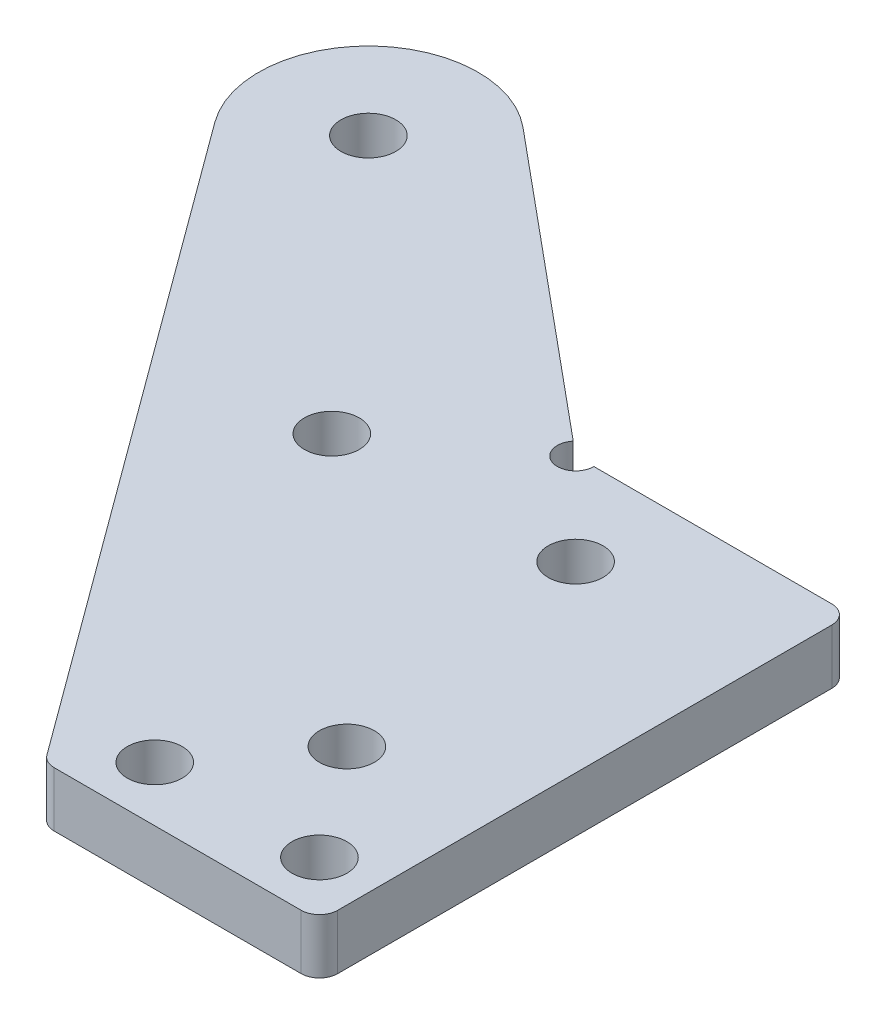
ISO-10303-21;
HEADER;
FILE_DESCRIPTION(('STEP AP214'),'2;1');
FILE_NAME('part.step','',(''),(''),'','','');
FILE_SCHEMA(('AUTOMOTIVE_DESIGN { 1 0 10303 214 1 1 1 1 }'));
ENDSEC;
DATA;
#1=APPLICATION_CONTEXT('core data for automotive mechanical design processes');
#2=APPLICATION_PROTOCOL_DEFINITION('international standard','automotive_design',2000,#1);
#3=PRODUCT_CONTEXT('',#1,'mechanical');
#4=PRODUCT('Part','Part','',(#3));
#5=PRODUCT_RELATED_PRODUCT_CATEGORY('part','',(#4));
#6=PRODUCT_DEFINITION_FORMATION('','',#4);
#7=PRODUCT_DEFINITION_CONTEXT('part definition',#1,'design');
#8=PRODUCT_DEFINITION('design','',#6,#7);
#9=PRODUCT_DEFINITION_SHAPE('','',#8);
#10=(LENGTH_UNIT() NAMED_UNIT(*) SI_UNIT(.MILLI.,.METRE.));
#11=(NAMED_UNIT(*) PLANE_ANGLE_UNIT() SI_UNIT($,.RADIAN.));
#12=(NAMED_UNIT(*) SI_UNIT($,.STERADIAN.) SOLID_ANGLE_UNIT());
#13=UNCERTAINTY_MEASURE_WITH_UNIT(LENGTH_MEASURE(1.E-05),#10,'distance_accuracy_value','');
#14=(GEOMETRIC_REPRESENTATION_CONTEXT(3) GLOBAL_UNCERTAINTY_ASSIGNED_CONTEXT((#13)) GLOBAL_UNIT_ASSIGNED_CONTEXT((#10,
#11,#12)) REPRESENTATION_CONTEXT('',''));
#15=CARTESIAN_POINT('',(0.,0.,0.));
#16=DIRECTION('',(0.,0.,1.));
#17=DIRECTION('',(1.,0.,0.));
#18=AXIS2_PLACEMENT_3D('',#15,#16,#17);
#19=CARTESIAN_POINT('',(-20.8250812548085,3.,-24.));
#20=DIRECTION('',(0.,1.,0.));
#21=DIRECTION('',(0.,0.,1.));
#22=AXIS2_PLACEMENT_3D('',#19,#20,#21);
#23=PLANE('',#22);
#24=CARTESIAN_POINT('',(-7.71745766964896,3.,-8.89403416031368));
#25=DIRECTION('',(0.,1.,0.));
#26=DIRECTION('',(0.,0.,1.));
#27=AXIS2_PLACEMENT_3D('',#24,#25,#26);
#28=CIRCLE('',#27,1.5);
#29=CARTESIAN_POINT('',(-7.71745766964896,3.,-7.39403416031368));
#30=VERTEX_POINT('',#29);
#31=EDGE_CURVE('E274',#30,#30,#28,.T.);
#32=ORIENTED_EDGE('',*,*,#31,.F.);
#33=EDGE_LOOP('',(#32));
#34=FACE_BOUND('',#33,.T.);
#35=CARTESIAN_POINT('',(7.50000000000001,3.,5.5));
#36=DIRECTION('',(0.,1.,0.));
#37=DIRECTION('',(0.,0.,1.));
#38=AXIS2_PLACEMENT_3D('',#35,#36,#37);
#39=CIRCLE('',#38,1.5);
#40=CARTESIAN_POINT('',(7.50000000000001,3.,7.));
#41=VERTEX_POINT('',#40);
#42=EDGE_CURVE('E258',#41,#41,#39,.T.);
#43=ORIENTED_EDGE('',*,*,#42,.F.);
#44=EDGE_LOOP('',(#43));
#45=FACE_BOUND('',#44,.T.);
#46=CARTESIAN_POINT('',(3.00000000000001,3.,11.5));
#47=DIRECTION('',(0.,1.,0.));
#48=DIRECTION('',(0.,0.,1.));
#49=AXIS2_PLACEMENT_3D('',#46,#47,#48);
#50=CIRCLE('',#49,1.5);
#51=CARTESIAN_POINT('',(3.00000000000001,3.,13.));
#52=VERTEX_POINT('',#51);
#53=EDGE_CURVE('E234',#52,#52,#50,.T.);
#54=ORIENTED_EDGE('',*,*,#53,.F.);
#55=EDGE_LOOP('',(#54));
#56=FACE_BOUND('',#55,.T.);
#57=DIRECTION('',(0.,0.,-1.));
#58=VECTOR('',#57,1.);
#59=CARTESIAN_POINT('',(15.,3.,-14.5));
#60=LINE('',#59,#58);
#61=CARTESIAN_POINT('',(15.,3.,13.5));
#62=VERTEX_POINT('',#61);
#63=CARTESIAN_POINT('',(15.,3.,-13.5));
#64=VERTEX_POINT('',#63);
#65=EDGE_CURVE('E212',#62,#64,#60,.T.);
#66=ORIENTED_EDGE('',*,*,#65,.T.);
#67=CARTESIAN_POINT('',(14.,3.,-13.5));
#68=DIRECTION('',(0.,1.,0.));
#69=DIRECTION('',(0.,0.,1.));
#70=AXIS2_PLACEMENT_3D('',#67,#68,#69);
#71=CIRCLE('',#70,1.);
#72=CARTESIAN_POINT('',(14.,3.,-14.5));
#73=VERTEX_POINT('',#72);
#74=EDGE_CURVE('E127',#64,#73,#71,.T.);
#75=ORIENTED_EDGE('',*,*,#74,.T.);
#76=DIRECTION('',(-1.,0.,0.));
#77=VECTOR('',#76,1.);
#78=CARTESIAN_POINT('',(1.00000000000001,3.,-14.5));
#79=LINE('',#78,#77);
#80=CARTESIAN_POINT('',(1.00000000000001,3.,-14.5));
#81=VERTEX_POINT('',#80);
#82=EDGE_CURVE('E120',#73,#81,#79,.T.);
#83=ORIENTED_EDGE('',*,*,#82,.T.);
#84=CARTESIAN_POINT('',(0.,3.,-14.5));
#85=DIRECTION('',(0.,-1.,0.));
#86=DIRECTION('',(0.,0.,1.));
#87=AXIS2_PLACEMENT_3D('',#84,#85,#86);
#88=CIRCLE('',#87,1.);
#89=CARTESIAN_POINT('',(-0.769199876693128,3.,-15.1390082547943));
#90=VERTEX_POINT('',#89);
#91=EDGE_CURVE('E124',#81,#90,#88,.T.);
#92=ORIENTED_EDGE('',*,*,#91,.T.);
#93=DIRECTION('',(-0.769199876693136,0.,-0.639008254794306));
#94=VECTOR('',#93,1.);
#95=CARTESIAN_POINT('',(-16.9910317260426,3.,-28.6151992601588));
#96=LINE('',#95,#94);
#97=CARTESIAN_POINT('',(-16.9910317260426,3.,-28.6151992601588));
#98=VERTEX_POINT('',#97);
#99=EDGE_CURVE('E143',#90,#98,#96,.T.);
#100=ORIENTED_EDGE('',*,*,#99,.T.);
#101=CARTESIAN_POINT('',(-20.8250812548085,3.,-24.));
#102=DIRECTION('',(0.,1.,0.));
#103=DIRECTION('',(0.,0.,1.));
#104=AXIS2_PLACEMENT_3D('',#101,#102,#103);
#105=CIRCLE('',#104,6.00000000000001);
#106=CARTESIAN_POINT('',(-25.6613869768904,3.,-20.4489231263519));
#107=VERTEX_POINT('',#106);
#108=EDGE_CURVE('E221',#98,#107,#105,.T.);
#109=ORIENTED_EDGE('',*,*,#108,.T.);
#110=DIRECTION('',(0.59184614560801,0.,0.806050953680313));
#111=VECTOR('',#110,1.);
#112=CARTESIAN_POINT('',(-25.6613869768904,3.,-20.4489231263519));
#113=LINE('',#112,#111);
#114=CARTESIAN_POINT('',(-0.299688604590068,3.,14.091846145608));
#115=VERTEX_POINT('',#114);
#116=EDGE_CURVE('E239',#107,#115,#113,.T.);
#117=ORIENTED_EDGE('',*,*,#116,.T.);
#118=CARTESIAN_POINT('',(0.50636234909025,3.,13.5));
#119=DIRECTION('',(0.,1.,0.));
#120=DIRECTION('',(0.,0.,1.));
#121=AXIS2_PLACEMENT_3D('',#118,#119,#120);
#122=CIRCLE('',#121,1.);
#123=CARTESIAN_POINT('',(0.50636234909025,3.,14.5));
#124=VERTEX_POINT('',#123);
#125=EDGE_CURVE('E66',#115,#124,#122,.T.);
#126=ORIENTED_EDGE('',*,*,#125,.T.);
#127=DIRECTION('',(1.,0.,0.));
#128=VECTOR('',#127,1.);
#129=CARTESIAN_POINT('',(15.,3.,14.5));
#130=LINE('',#129,#128);
#131=CARTESIAN_POINT('',(14.,3.,14.5));
#132=VERTEX_POINT('',#131);
#133=EDGE_CURVE('E190',#124,#132,#130,.T.);
#134=ORIENTED_EDGE('',*,*,#133,.T.);
#135=CARTESIAN_POINT('',(14.,3.,13.5));
#136=DIRECTION('',(0.,1.,0.));
#137=DIRECTION('',(0.,0.,1.));
#138=AXIS2_PLACEMENT_3D('',#135,#136,#137);
#139=CIRCLE('',#138,1.);
#140=EDGE_CURVE('E177',#132,#62,#139,.T.);
#141=ORIENTED_EDGE('',*,*,#140,.T.);
#142=EDGE_LOOP('',(#66,#75,#83,#92,#100,#109,#117,#126,#134,#141));
#143=FACE_BOUND('',#142,.T.);
#144=CARTESIAN_POINT('',(12.,3.,11.5));
#145=DIRECTION('',(0.,1.,0.));
#146=DIRECTION('',(0.,0.,1.));
#147=AXIS2_PLACEMENT_3D('',#144,#145,#146);
#148=CIRCLE('',#147,1.5);
#149=CARTESIAN_POINT('',(12.,3.,13.));
#150=VERTEX_POINT('',#149);
#151=EDGE_CURVE('E250',#150,#150,#148,.T.);
#152=ORIENTED_EDGE('',*,*,#151,.F.);
#153=EDGE_LOOP('',(#152));
#154=FACE_BOUND('',#153,.T.);
#155=CARTESIAN_POINT('',(5.,3.,-9.50000000000002));
#156=DIRECTION('',(0.,1.,0.));
#157=DIRECTION('',(0.,0.,1.));
#158=AXIS2_PLACEMENT_3D('',#155,#156,#157);
#159=CIRCLE('',#158,1.5);
#160=CARTESIAN_POINT('',(5.,3.,-8.00000000000002));
#161=VERTEX_POINT('',#160);
#162=EDGE_CURVE('E266',#161,#161,#159,.T.);
#163=ORIENTED_EDGE('',*,*,#162,.F.);
#164=EDGE_LOOP('',(#163));
#165=FACE_BOUND('',#164,.T.);
#166=CARTESIAN_POINT('',(-20.8250812548085,3.,-24.));
#167=DIRECTION('',(0.,1.,0.));
#168=DIRECTION('',(0.,0.,1.));
#169=AXIS2_PLACEMENT_3D('',#166,#167,#168);
#170=CIRCLE('',#169,1.5);
#171=CARTESIAN_POINT('',(-20.8250812548085,3.,-22.5));
#172=VERTEX_POINT('',#171);
#173=EDGE_CURVE('E282',#172,#172,#170,.T.);
#174=ORIENTED_EDGE('',*,*,#173,.F.);
#175=EDGE_LOOP('',(#174));
#176=FACE_BOUND('',#175,.T.);
#177=ADVANCED_FACE('F44',(#34,#45,#56,#143,#154,#165,#176),#23,.T.);
#178=CARTESIAN_POINT('',(-20.8250812548085,0.,-24.));
#179=DIRECTION('',(0.,1.,0.));
#180=DIRECTION('',(0.,0.,1.));
#181=AXIS2_PLACEMENT_3D('',#178,#179,#180);
#182=PLANE('',#181);
#183=DIRECTION('',(-1.,0.,0.));
#184=VECTOR('',#183,1.);
#185=CARTESIAN_POINT('',(1.00000000000001,0.,-14.5));
#186=LINE('',#185,#184);
#187=CARTESIAN_POINT('',(14.,0.,-14.5));
#188=VERTEX_POINT('',#187);
#189=CARTESIAN_POINT('',(1.00000000000001,0.,-14.5));
#190=VERTEX_POINT('',#189);
#191=EDGE_CURVE('E147',#188,#190,#186,.T.);
#192=ORIENTED_EDGE('',*,*,#191,.F.);
#193=CARTESIAN_POINT('',(14.,0.,-13.5));
#194=DIRECTION('',(0.,1.,0.));
#195=DIRECTION('',(0.,0.,1.));
#196=AXIS2_PLACEMENT_3D('',#193,#194,#195);
#197=CIRCLE('',#196,1.);
#198=CARTESIAN_POINT('',(15.,0.,-13.5));
#199=VERTEX_POINT('',#198);
#200=EDGE_CURVE('E165',#188,#199,#197,.F.);
#201=ORIENTED_EDGE('',*,*,#200,.T.);
#202=DIRECTION('',(0.,0.,-1.));
#203=VECTOR('',#202,1.);
#204=CARTESIAN_POINT('',(15.,0.,-14.5));
#205=LINE('',#204,#203);
#206=CARTESIAN_POINT('',(15.,0.,13.5));
#207=VERTEX_POINT('',#206);
#208=EDGE_CURVE('E133',#207,#199,#205,.T.);
#209=ORIENTED_EDGE('',*,*,#208,.F.);
#210=CARTESIAN_POINT('',(14.,0.,13.5));
#211=DIRECTION('',(0.,1.,0.));
#212=DIRECTION('',(0.,0.,1.));
#213=AXIS2_PLACEMENT_3D('',#210,#211,#212);
#214=CIRCLE('',#213,1.);
#215=CARTESIAN_POINT('',(14.,0.,14.5));
#216=VERTEX_POINT('',#215);
#217=EDGE_CURVE('E162',#207,#216,#214,.F.);
#218=ORIENTED_EDGE('',*,*,#217,.T.);
#219=DIRECTION('',(1.,0.,0.));
#220=VECTOR('',#219,1.);
#221=CARTESIAN_POINT('',(15.,0.,14.5));
#222=LINE('',#221,#220);
#223=CARTESIAN_POINT('',(0.50636234909025,0.,14.5));
#224=VERTEX_POINT('',#223);
#225=EDGE_CURVE('E189',#224,#216,#222,.T.);
#226=ORIENTED_EDGE('',*,*,#225,.F.);
#227=CARTESIAN_POINT('',(0.50636234909025,0.,13.5));
#228=DIRECTION('',(0.,1.,0.));
#229=DIRECTION('',(0.,0.,1.));
#230=AXIS2_PLACEMENT_3D('',#227,#228,#229);
#231=CIRCLE('',#230,1.);
#232=CARTESIAN_POINT('',(-0.299688604590068,0.,14.091846145608));
#233=VERTEX_POINT('',#232);
#234=EDGE_CURVE('E154',#224,#233,#231,.F.);
#235=ORIENTED_EDGE('',*,*,#234,.T.);
#236=DIRECTION('',(0.59184614560801,0.,0.806050953680313));
#237=VECTOR('',#236,1.);
#238=CARTESIAN_POINT('',(-25.6613869768904,0.,-20.4489231263519));
#239=LINE('',#238,#237);
#240=CARTESIAN_POINT('',(-25.6613869768904,0.,-20.4489231263519));
#241=VERTEX_POINT('',#240);
#242=EDGE_CURVE('E199',#241,#233,#239,.T.);
#243=ORIENTED_EDGE('',*,*,#242,.F.);
#244=CARTESIAN_POINT('',(-20.8250812548085,0.,-24.));
#245=DIRECTION('',(0.,1.,0.));
#246=DIRECTION('',(0.,0.,1.));
#247=AXIS2_PLACEMENT_3D('',#244,#245,#246);
#248=CIRCLE('',#247,6.00000000000001);
#249=CARTESIAN_POINT('',(-16.9910317260426,0.,-28.6151992601588));
#250=VERTEX_POINT('',#249);
#251=EDGE_CURVE('E205',#250,#241,#248,.T.);
#252=ORIENTED_EDGE('',*,*,#251,.F.);
#253=DIRECTION('',(-0.769199876693136,0.,-0.639008254794306));
#254=VECTOR('',#253,1.);
#255=CARTESIAN_POINT('',(-16.9910317260426,0.,-28.6151992601588));
#256=LINE('',#255,#254);
#257=CARTESIAN_POINT('',(-0.769199876693128,0.,-15.1390082547943));
#258=VERTEX_POINT('',#257);
#259=EDGE_CURVE('E224',#258,#250,#256,.T.);
#260=ORIENTED_EDGE('',*,*,#259,.F.);
#261=CARTESIAN_POINT('',(0.,0.,-14.5));
#262=DIRECTION('',(0.,-1.,0.));
#263=DIRECTION('',(0.,0.,1.));
#264=AXIS2_PLACEMENT_3D('',#261,#262,#263);
#265=CIRCLE('',#264,1.);
#266=EDGE_CURVE('E227',#190,#258,#265,.T.);
#267=ORIENTED_EDGE('',*,*,#266,.F.);
#268=EDGE_LOOP('',(#192,#201,#209,#218,#226,#235,#243,#252,#260,#267));
#269=FACE_BOUND('',#268,.T.);
#270=CARTESIAN_POINT('',(3.00000000000001,0.,11.5));
#271=DIRECTION('',(0.,1.,0.));
#272=DIRECTION('',(0.,0.,1.));
#273=AXIS2_PLACEMENT_3D('',#270,#271,#272);
#274=CIRCLE('',#273,1.5);
#275=CARTESIAN_POINT('',(3.00000000000001,0.,13.));
#276=VERTEX_POINT('',#275);
#277=EDGE_CURVE('E246',#276,#276,#274,.T.);
#278=ORIENTED_EDGE('',*,*,#277,.T.);
#279=EDGE_LOOP('',(#278));
#280=FACE_BOUND('',#279,.T.);
#281=CARTESIAN_POINT('',(12.,0.,11.5));
#282=DIRECTION('',(0.,1.,0.));
#283=DIRECTION('',(0.,0.,1.));
#284=AXIS2_PLACEMENT_3D('',#281,#282,#283);
#285=CIRCLE('',#284,1.5);
#286=CARTESIAN_POINT('',(12.,0.,13.));
#287=VERTEX_POINT('',#286);
#288=EDGE_CURVE('E254',#287,#287,#285,.T.);
#289=ORIENTED_EDGE('',*,*,#288,.T.);
#290=EDGE_LOOP('',(#289));
#291=FACE_BOUND('',#290,.T.);
#292=CARTESIAN_POINT('',(7.50000000000001,0.,5.5));
#293=DIRECTION('',(0.,1.,0.));
#294=DIRECTION('',(0.,0.,1.));
#295=AXIS2_PLACEMENT_3D('',#292,#293,#294);
#296=CIRCLE('',#295,1.5);
#297=CARTESIAN_POINT('',(7.50000000000001,0.,7.));
#298=VERTEX_POINT('',#297);
#299=EDGE_CURVE('E262',#298,#298,#296,.T.);
#300=ORIENTED_EDGE('',*,*,#299,.T.);
#301=EDGE_LOOP('',(#300));
#302=FACE_BOUND('',#301,.T.);
#303=CARTESIAN_POINT('',(5.,0.,-9.50000000000002));
#304=DIRECTION('',(0.,1.,0.));
#305=DIRECTION('',(0.,0.,1.));
#306=AXIS2_PLACEMENT_3D('',#303,#304,#305);
#307=CIRCLE('',#306,1.5);
#308=CARTESIAN_POINT('',(5.,0.,-8.00000000000002));
#309=VERTEX_POINT('',#308);
#310=EDGE_CURVE('E270',#309,#309,#307,.T.);
#311=ORIENTED_EDGE('',*,*,#310,.T.);
#312=EDGE_LOOP('',(#311));
#313=FACE_BOUND('',#312,.T.);
#314=CARTESIAN_POINT('',(-7.71745766964896,0.,-8.89403416031368));
#315=DIRECTION('',(0.,1.,0.));
#316=DIRECTION('',(0.,0.,1.));
#317=AXIS2_PLACEMENT_3D('',#314,#315,#316);
#318=CIRCLE('',#317,1.5);
#319=CARTESIAN_POINT('',(-7.71745766964896,0.,-7.39403416031368));
#320=VERTEX_POINT('',#319);
#321=EDGE_CURVE('E278',#320,#320,#318,.T.);
#322=ORIENTED_EDGE('',*,*,#321,.T.);
#323=EDGE_LOOP('',(#322));
#324=FACE_BOUND('',#323,.T.);
#325=CARTESIAN_POINT('',(-20.8250812548085,0.,-24.));
#326=DIRECTION('',(0.,1.,0.));
#327=DIRECTION('',(0.,0.,1.));
#328=AXIS2_PLACEMENT_3D('',#325,#326,#327);
#329=CIRCLE('',#328,1.5);
#330=CARTESIAN_POINT('',(-20.8250812548085,0.,-22.5));
#331=VERTEX_POINT('',#330);
#332=EDGE_CURVE('E286',#331,#331,#329,.T.);
#333=ORIENTED_EDGE('',*,*,#332,.T.);
#334=EDGE_LOOP('',(#333));
#335=FACE_BOUND('',#334,.T.);
#336=ADVANCED_FACE('F193',(#269,#280,#291,#302,#313,#324,#335),#182,.F.);
#337=CARTESIAN_POINT('',(1.00000000000001,3.,-14.5));
#338=DIRECTION('',(0.,0.,1.));
#339=DIRECTION('',(1.,0.,0.));
#340=AXIS2_PLACEMENT_3D('',#337,#338,#339);
#341=PLANE('',#340);
#342=ORIENTED_EDGE('',*,*,#82,.F.);
#343=DIRECTION('',(0.,-1.,0.));
#344=VECTOR('',#343,1.);
#345=CARTESIAN_POINT('',(14.,3.,-14.5));
#346=LINE('',#345,#344);
#347=EDGE_CURVE('E150',#73,#188,#346,.T.);
#348=ORIENTED_EDGE('',*,*,#347,.T.);
#349=ORIENTED_EDGE('',*,*,#191,.T.);
#350=DIRECTION('',(0.,-1.,0.));
#351=VECTOR('',#350,1.);
#352=CARTESIAN_POINT('',(1.00000000000001,3.,-14.5));
#353=LINE('',#352,#351);
#354=EDGE_CURVE('E138',#81,#190,#353,.T.);
#355=ORIENTED_EDGE('',*,*,#354,.F.);
#356=EDGE_LOOP('',(#342,#348,#349,#355));
#357=FACE_BOUND('',#356,.T.);
#358=ADVANCED_FACE('F145',(#357),#341,.F.);
#359=CARTESIAN_POINT('',(0.,3.,-14.5));
#360=DIRECTION('',(0.,-1.,0.));
#361=DIRECTION('',(0.,0.,-1.));
#362=AXIS2_PLACEMENT_3D('',#359,#360,#361);
#363=CYLINDRICAL_SURFACE('',#362,1.);
#364=ORIENTED_EDGE('',*,*,#266,.T.);
#365=DIRECTION('',(0.,-1.,0.));
#366=VECTOR('',#365,1.);
#367=CARTESIAN_POINT('',(-0.769199876693128,3.,-15.1390082547943));
#368=LINE('',#367,#366);
#369=EDGE_CURVE('E140',#90,#258,#368,.T.);
#370=ORIENTED_EDGE('',*,*,#369,.F.);
#371=ORIENTED_EDGE('',*,*,#91,.F.);
#372=ORIENTED_EDGE('',*,*,#354,.T.);
#373=EDGE_LOOP('',(#364,#370,#371,#372));
#374=FACE_BOUND('',#373,.T.);
#375=ADVANCED_FACE('F137',(#374),#363,.F.);
#376=CARTESIAN_POINT('',(-16.9910317260426,3.,-28.6151992601588));
#377=DIRECTION('',(-0.639008254794306,0.,0.769199876693136));
#378=DIRECTION('',(0.769199876693136,0.,0.639008254794306));
#379=AXIS2_PLACEMENT_3D('',#376,#377,#378);
#380=PLANE('',#379);
#381=ORIENTED_EDGE('',*,*,#259,.T.);
#382=DIRECTION('',(0.,-1.,0.));
#383=VECTOR('',#382,1.);
#384=CARTESIAN_POINT('',(-16.9910317260426,3.,-28.6151992601588));
#385=LINE('',#384,#383);
#386=EDGE_CURVE('E156',#98,#250,#385,.T.);
#387=ORIENTED_EDGE('',*,*,#386,.F.);
#388=ORIENTED_EDGE('',*,*,#99,.F.);
#389=ORIENTED_EDGE('',*,*,#369,.T.);
#390=EDGE_LOOP('',(#381,#387,#388,#389));
#391=FACE_BOUND('',#390,.T.);
#392=ADVANCED_FACE('F323',(#391),#380,.F.);
#393=CARTESIAN_POINT('',(-20.8250812548085,3.,-24.));
#394=DIRECTION('',(0.,-1.,0.));
#395=DIRECTION('',(0.,0.,-1.));
#396=AXIS2_PLACEMENT_3D('',#393,#394,#395);
#397=CYLINDRICAL_SURFACE('',#396,6.00000000000001);
#398=ORIENTED_EDGE('',*,*,#251,.T.);
#399=DIRECTION('',(0.,-1.,0.));
#400=VECTOR('',#399,1.);
#401=CARTESIAN_POINT('',(-25.6613869768904,3.,-20.4489231263519));
#402=LINE('',#401,#400);
#403=EDGE_CURVE('E209',#107,#241,#402,.T.);
#404=ORIENTED_EDGE('',*,*,#403,.F.);
#405=ORIENTED_EDGE('',*,*,#108,.F.);
#406=ORIENTED_EDGE('',*,*,#386,.T.);
#407=EDGE_LOOP('',(#398,#404,#405,#406));
#408=FACE_BOUND('',#407,.T.);
#409=ADVANCED_FACE('F219',(#408),#397,.T.);
#410=CARTESIAN_POINT('',(-25.6613869768904,3.,-20.4489231263519));
#411=DIRECTION('',(0.806050953680313,0.,-0.591846145608011));
#412=DIRECTION('',(-0.591846145608011,0.,-0.806050953680313));
#413=AXIS2_PLACEMENT_3D('',#410,#411,#412);
#414=PLANE('',#413);
#415=ORIENTED_EDGE('',*,*,#242,.T.);
#416=DIRECTION('',(0.,-1.,0.));
#417=VECTOR('',#416,1.);
#418=CARTESIAN_POINT('',(-0.299688604590061,3.,14.091846145608));
#419=LINE('',#418,#417);
#420=EDGE_CURVE('E11',#233,#115,#419,.F.);
#421=ORIENTED_EDGE('',*,*,#420,.T.);
#422=ORIENTED_EDGE('',*,*,#116,.F.);
#423=ORIENTED_EDGE('',*,*,#403,.T.);
#424=EDGE_LOOP('',(#415,#421,#422,#423));
#425=FACE_BOUND('',#424,.T.);
#426=ADVANCED_FACE('F317',(#425),#414,.F.);
#427=CARTESIAN_POINT('',(15.,3.,14.5));
#428=DIRECTION('',(0.,0.,-1.));
#429=DIRECTION('',(-1.,0.,0.));
#430=AXIS2_PLACEMENT_3D('',#427,#428,#429);
#431=PLANE('',#430);
#432=ORIENTED_EDGE('',*,*,#225,.T.);
#433=DIRECTION('',(0.,-1.,0.));
#434=VECTOR('',#433,1.);
#435=CARTESIAN_POINT('',(14.,3.,14.5));
#436=LINE('',#435,#434);
#437=EDGE_CURVE('E53',#216,#132,#436,.F.);
#438=ORIENTED_EDGE('',*,*,#437,.T.);
#439=ORIENTED_EDGE('',*,*,#133,.F.);
#440=DIRECTION('',(0.,-1.,0.));
#441=VECTOR('',#440,1.);
#442=CARTESIAN_POINT('',(0.50636234909025,3.,14.5));
#443=LINE('',#442,#441);
#444=EDGE_CURVE('E182',#124,#224,#443,.T.);
#445=ORIENTED_EDGE('',*,*,#444,.T.);
#446=EDGE_LOOP('',(#432,#438,#439,#445));
#447=FACE_BOUND('',#446,.T.);
#448=ADVANCED_FACE('F188',(#447),#431,.F.);
#449=CARTESIAN_POINT('',(15.,3.,-14.5));
#450=DIRECTION('',(-1.,0.,0.));
#451=DIRECTION('',(0.,0.,1.));
#452=AXIS2_PLACEMENT_3D('',#449,#450,#451);
#453=PLANE('',#452);
#454=ORIENTED_EDGE('',*,*,#208,.T.);
#455=DIRECTION('',(0.,-1.,0.));
#456=VECTOR('',#455,1.);
#457=CARTESIAN_POINT('',(15.,3.,-13.5));
#458=LINE('',#457,#456);
#459=EDGE_CURVE('E172',#199,#64,#458,.F.);
#460=ORIENTED_EDGE('',*,*,#459,.T.);
#461=ORIENTED_EDGE('',*,*,#65,.F.);
#462=DIRECTION('',(0.,-1.,0.));
#463=VECTOR('',#462,1.);
#464=CARTESIAN_POINT('',(15.,3.,13.5));
#465=LINE('',#464,#463);
#466=EDGE_CURVE('E168',#62,#207,#465,.T.);
#467=ORIENTED_EDGE('',*,*,#466,.T.);
#468=EDGE_LOOP('',(#454,#460,#461,#467));
#469=FACE_BOUND('',#468,.T.);
#470=ADVANCED_FACE('F311',(#469),#453,.F.);
#471=CARTESIAN_POINT('',(3.00000000000001,3.,11.5));
#472=DIRECTION('',(0.,-1.,0.));
#473=DIRECTION('',(0.,0.,-1.));
#474=AXIS2_PLACEMENT_3D('',#471,#472,#473);
#475=CYLINDRICAL_SURFACE('',#474,1.5);
#476=ORIENTED_EDGE('',*,*,#53,.T.);
#477=EDGE_LOOP('',(#476));
#478=FACE_BOUND('',#477,.T.);
#479=ORIENTED_EDGE('',*,*,#277,.F.);
#480=EDGE_LOOP('',(#479));
#481=FACE_BOUND('',#480,.T.);
#482=ADVANCED_FACE('F308',(#478,#481),#475,.F.);
#483=CARTESIAN_POINT('',(12.,3.,11.5));
#484=DIRECTION('',(0.,-1.,0.));
#485=DIRECTION('',(0.,0.,-1.));
#486=AXIS2_PLACEMENT_3D('',#483,#484,#485);
#487=CYLINDRICAL_SURFACE('',#486,1.5);
#488=ORIENTED_EDGE('',*,*,#151,.T.);
#489=EDGE_LOOP('',(#488));
#490=FACE_BOUND('',#489,.T.);
#491=ORIENTED_EDGE('',*,*,#288,.F.);
#492=EDGE_LOOP('',(#491));
#493=FACE_BOUND('',#492,.T.);
#494=ADVANCED_FACE('F395',(#490,#493),#487,.F.);
#495=CARTESIAN_POINT('',(7.50000000000001,3.,5.5));
#496=DIRECTION('',(0.,-1.,0.));
#497=DIRECTION('',(0.,0.,-1.));
#498=AXIS2_PLACEMENT_3D('',#495,#496,#497);
#499=CYLINDRICAL_SURFACE('',#498,1.5);
#500=ORIENTED_EDGE('',*,*,#42,.T.);
#501=EDGE_LOOP('',(#500));
#502=FACE_BOUND('',#501,.T.);
#503=ORIENTED_EDGE('',*,*,#299,.F.);
#504=EDGE_LOOP('',(#503));
#505=FACE_BOUND('',#504,.T.);
#506=ADVANCED_FACE('F385',(#502,#505),#499,.F.);
#507=CARTESIAN_POINT('',(5.,3.,-9.50000000000002));
#508=DIRECTION('',(0.,-1.,0.));
#509=DIRECTION('',(0.,0.,-1.));
#510=AXIS2_PLACEMENT_3D('',#507,#508,#509);
#511=CYLINDRICAL_SURFACE('',#510,1.5);
#512=ORIENTED_EDGE('',*,*,#162,.T.);
#513=EDGE_LOOP('',(#512));
#514=FACE_BOUND('',#513,.T.);
#515=ORIENTED_EDGE('',*,*,#310,.F.);
#516=EDGE_LOOP('',(#515));
#517=FACE_BOUND('',#516,.T.);
#518=ADVANCED_FACE('F375',(#514,#517),#511,.F.);
#519=CARTESIAN_POINT('',(-7.71745766964896,3.,-8.89403416031368));
#520=DIRECTION('',(0.,-1.,0.));
#521=DIRECTION('',(0.,0.,-1.));
#522=AXIS2_PLACEMENT_3D('',#519,#520,#521);
#523=CYLINDRICAL_SURFACE('',#522,1.5);
#524=ORIENTED_EDGE('',*,*,#31,.T.);
#525=EDGE_LOOP('',(#524));
#526=FACE_BOUND('',#525,.T.);
#527=ORIENTED_EDGE('',*,*,#321,.F.);
#528=EDGE_LOOP('',(#527));
#529=FACE_BOUND('',#528,.T.);
#530=ADVANCED_FACE('F366',(#526,#529),#523,.F.);
#531=CARTESIAN_POINT('',(-20.8250812548085,3.,-24.));
#532=DIRECTION('',(0.,-1.,0.));
#533=DIRECTION('',(0.,0.,-1.));
#534=AXIS2_PLACEMENT_3D('',#531,#532,#533);
#535=CYLINDRICAL_SURFACE('',#534,1.5);
#536=ORIENTED_EDGE('',*,*,#173,.T.);
#537=EDGE_LOOP('',(#536));
#538=FACE_BOUND('',#537,.T.);
#539=ORIENTED_EDGE('',*,*,#332,.F.);
#540=EDGE_LOOP('',(#539));
#541=FACE_BOUND('',#540,.T.);
#542=ADVANCED_FACE('F294',(#538,#541),#535,.F.);
#543=CARTESIAN_POINT('',(14.,3.,-13.5));
#544=DIRECTION('',(0.,-1.,0.));
#545=DIRECTION('',(0.,0.,-1.));
#546=AXIS2_PLACEMENT_3D('',#543,#544,#545);
#547=CYLINDRICAL_SURFACE('',#546,1.);
#548=ORIENTED_EDGE('',*,*,#74,.F.);
#549=ORIENTED_EDGE('',*,*,#459,.F.);
#550=ORIENTED_EDGE('',*,*,#200,.F.);
#551=ORIENTED_EDGE('',*,*,#347,.F.);
#552=EDGE_LOOP('',(#548,#549,#550,#551));
#553=FACE_BOUND('',#552,.T.);
#554=ADVANCED_FACE('F330',(#553),#547,.T.);
#555=CARTESIAN_POINT('',(14.,3.,13.5));
#556=DIRECTION('',(0.,-1.,0.));
#557=DIRECTION('',(0.,0.,-1.));
#558=AXIS2_PLACEMENT_3D('',#555,#556,#557);
#559=CYLINDRICAL_SURFACE('',#558,1.);
#560=ORIENTED_EDGE('',*,*,#140,.F.);
#561=ORIENTED_EDGE('',*,*,#437,.F.);
#562=ORIENTED_EDGE('',*,*,#217,.F.);
#563=ORIENTED_EDGE('',*,*,#466,.F.);
#564=EDGE_LOOP('',(#560,#561,#562,#563));
#565=FACE_BOUND('',#564,.T.);
#566=ADVANCED_FACE('F332',(#565),#559,.T.);
#567=CARTESIAN_POINT('',(0.50636234909025,3.,13.5));
#568=DIRECTION('',(0.,-1.,0.));
#569=DIRECTION('',(0.,0.,-1.));
#570=AXIS2_PLACEMENT_3D('',#567,#568,#569);
#571=CYLINDRICAL_SURFACE('',#570,1.);
#572=ORIENTED_EDGE('',*,*,#125,.F.);
#573=ORIENTED_EDGE('',*,*,#420,.F.);
#574=ORIENTED_EDGE('',*,*,#234,.F.);
#575=ORIENTED_EDGE('',*,*,#444,.F.);
#576=EDGE_LOOP('',(#572,#573,#574,#575));
#577=FACE_BOUND('',#576,.T.);
#578=ADVANCED_FACE('F46',(#577),#571,.T.);
#579=CLOSED_SHELL('',(#177,#336,#358,#375,#392,#409,#426,#448,#470,#482,#494,#506,#518,#530,
#542,#554,#566,#578));
#580=MANIFOLD_SOLID_BREP('B2',#579);
#581=ADVANCED_BREP_SHAPE_REPRESENTATION('',(#18,#580),#14);
#582=SHAPE_DEFINITION_REPRESENTATION(#9,#581);
ENDSEC;
END-ISO-10303-21;
